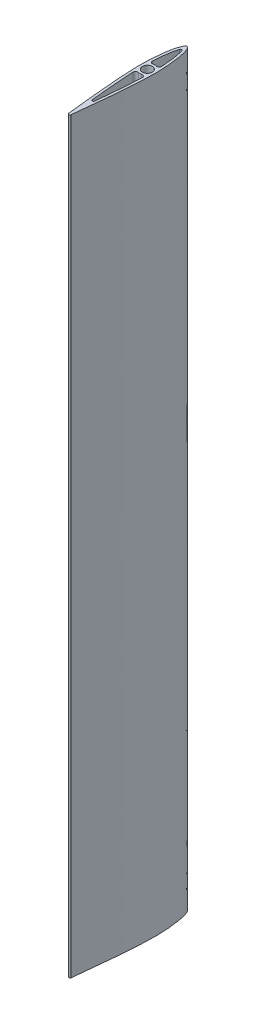
ISO-10303-21;
HEADER;
FILE_DESCRIPTION(('STEP AP214'),'2;1');
FILE_NAME('part.step','',(''),(''),'','','');
FILE_SCHEMA(('AUTOMOTIVE_DESIGN { 1 0 10303 214 1 1 1 1 }'));
ENDSEC;
DATA;
#1=APPLICATION_CONTEXT('core data for automotive mechanical design processes');
#2=APPLICATION_PROTOCOL_DEFINITION('international standard','automotive_design',2000,#1);
#3=PRODUCT_CONTEXT('',#1,'mechanical');
#4=PRODUCT('Part','Part','',(#3));
#5=PRODUCT_RELATED_PRODUCT_CATEGORY('part','',(#4));
#6=PRODUCT_DEFINITION_FORMATION('','',#4);
#7=PRODUCT_DEFINITION_CONTEXT('part definition',#1,'design');
#8=PRODUCT_DEFINITION('design','',#6,#7);
#9=PRODUCT_DEFINITION_SHAPE('','',#8);
#10=(LENGTH_UNIT() NAMED_UNIT(*) SI_UNIT(.MILLI.,.METRE.));
#11=(NAMED_UNIT(*) PLANE_ANGLE_UNIT() SI_UNIT($,.RADIAN.));
#12=(NAMED_UNIT(*) SI_UNIT($,.STERADIAN.) SOLID_ANGLE_UNIT());
#13=UNCERTAINTY_MEASURE_WITH_UNIT(LENGTH_MEASURE(1.E-05),#10,'distance_accuracy_value','');
#14=(GEOMETRIC_REPRESENTATION_CONTEXT(3) GLOBAL_UNCERTAINTY_ASSIGNED_CONTEXT((#13)) GLOBAL_UNIT_ASSIGNED_CONTEXT((#10,
#11,#12)) REPRESENTATION_CONTEXT('',''));
#15=CARTESIAN_POINT('',(0.,0.,0.));
#16=DIRECTION('',(0.,0.,1.));
#17=DIRECTION('',(1.,0.,0.));
#18=AXIS2_PLACEMENT_3D('',#15,#16,#17);
#19=CARTESIAN_POINT('',(-2.48951159685196,300.,-8.35675092429295));
#20=DIRECTION('',(0.,-1.,0.));
#21=DIRECTION('',(0.,0.,-1.));
#22=AXIS2_PLACEMENT_3D('',#19,#20,#21);
#23=PLANE('',#22);
#24=CARTESIAN_POINT('',(0.,300.,26.4458938838285));
#25=CARTESIAN_POINT('',(0.0604884544174839,300.,25.8806828526784));
#26=CARTESIAN_POINT('',(0.120261397903082,300.,25.3153955151066));
#27=CARTESIAN_POINT('',(0.238344658882728,300.,24.1846676612708));
#28=CARTESIAN_POINT('',(0.296654975228798,300.,23.6192271448869));
#29=CARTESIAN_POINT('',(0.46934988647915,300.,21.922622767737));
#30=CARTESIAN_POINT('',(0.581492710666243,300.,20.791229592031));
#31=CARTESIAN_POINT('',(0.799222248623128,300.,18.5278035549717));
#32=CARTESIAN_POINT('',(0.904808912589911,300.,17.3957706888251));
#33=CARTESIAN_POINT('',(1.10777266978677,300.,15.1378742653523));
#34=CARTESIAN_POINT('',(1.20519560449703,300.,14.0120148605878));
#35=CARTESIAN_POINT('',(1.34434800145996,300.,12.3226455329832));
#36=CARTESIAN_POINT('',(1.38956869703072,300.,11.7594226041168));
#37=CARTESIAN_POINT('',(1.47732755587827,300.,10.6327682570804));
#38=CARTESIAN_POINT('',(1.51986572562252,300.,10.0693368394163));
#39=CARTESIAN_POINT('',(1.60179910789095,300.,8.94219716133277));
#40=CARTESIAN_POINT('',(1.64119405587007,300.,8.37848888162041));
#41=CARTESIAN_POINT('',(1.71617934482378,300.,7.25082058222964));
#42=CARTESIAN_POINT('',(1.75176971133768,300.,6.68686056426661));
#43=CARTESIAN_POINT('',(1.81011095295501,300.,5.69524801787385));
#44=CARTESIAN_POINT('',(1.83388406238199,300.,5.26765577427957));
#45=CARTESIAN_POINT('',(1.8780261737644,300.,4.41230851670016));
#46=CARTESIAN_POINT('',(1.89839530550231,300.,3.98455350954419));
#47=CARTESIAN_POINT('',(1.92565085355559,300.,3.34280068687028));
#48=CARTESIAN_POINT('',(1.93418603397729,300.,3.1288726810992));
#49=CARTESIAN_POINT('',(1.94998022783016,300.,2.70096922930312));
#50=CARTESIAN_POINT('',(1.95723924216228,300.,2.48699378331172));
#51=CARTESIAN_POINT('',(1.97023405628435,300.,2.05900691390744));
#52=CARTESIAN_POINT('',(1.97596993464033,300.,1.84499549292024));
#53=CARTESIAN_POINT('',(1.98570942252621,300.,1.41693366877384));
#54=CARTESIAN_POINT('',(1.98971303236889,300.,1.20288326562169));
#55=CARTESIAN_POINT('',(1.99894444353483,300.,0.558488721596059));
#56=CARTESIAN_POINT('',(2.00132276701231,300.,0.128098310069688));
#57=CARTESIAN_POINT('',(1.99726528304949,300.,-0.732669519451628));
#58=CARTESIAN_POINT('',(1.99082905903567,300.,-1.16304693587114));
#59=CARTESIAN_POINT('',(1.97418215077185,300.,-1.80842525154572));
#60=CARTESIAN_POINT('',(1.96746770332538,300.,-2.02352109373421));
#61=CARTESIAN_POINT('',(1.95181475591698,300.,-2.45363295968739));
#62=CARTESIAN_POINT('',(1.9428762472295,300.,-2.66864898313562));
#63=CARTESIAN_POINT('',(1.92302236193378,300.,-3.0985610113626));
#64=CARTESIAN_POINT('',(1.91210723554636,300.,-3.31345702788311));
#65=CARTESIAN_POINT('',(1.88873464475596,300.,-3.74316482417585));
#66=CARTESIAN_POINT('',(1.87627717992888,300.,-3.95797660392492));
#67=CARTESIAN_POINT('',(1.85160476390733,300.,-4.35702905276403));
#68=CARTESIAN_POINT('',(1.83960616738222,300.,-4.54128305425929));
#69=CARTESIAN_POINT('',(1.81433225835347,300.,-4.90970254202918));
#70=CARTESIAN_POINT('',(1.80105694997973,300.,-5.09386802858821));
#71=CARTESIAN_POINT('',(1.75920553981811,300.,-5.64621204910645));
#72=CARTESIAN_POINT('',(1.72860382609733,300.,-6.01424022292783));
#73=CARTESIAN_POINT('',(1.6612804186876,300.,-6.7498510653373));
#74=CARTESIAN_POINT('',(1.62455688366905,300.,-7.11743356626721));
#75=CARTESIAN_POINT('',(1.54405762519054,300.,-7.85210093867567));
#76=CARTESIAN_POINT('',(1.50027685346815,300.,-8.21918526281311));
#77=CARTESIAN_POINT('',(1.4048501975757,300.,-8.94941755735853));
#78=CARTESIAN_POINT('',(1.3532685038648,300.,-9.31257386028028));
#79=CARTESIAN_POINT('',(1.24039563656631,300.,-10.0373464059866));
#80=CARTESIAN_POINT('',(1.1791059608335,300.,-10.3989628775291));
#81=CARTESIAN_POINT('',(1.07811723546684,300.,-10.9395398382283));
#82=CARTESIAN_POINT('',(1.04296130457526,300.,-11.1193520020009));
#83=CARTESIAN_POINT('',(0.969198959358473,300.,-11.4782647966849));
#84=CARTESIAN_POINT('',(0.930592676312161,300.,-11.6573654543971));
#85=CARTESIAN_POINT('',(0.849415753225838,300.,-12.0145718905195));
#86=CARTESIAN_POINT('',(0.806847175103314,300.,-12.1926781358203));
#87=CARTESIAN_POINT('',(0.717013901655104,300.,-12.5476954798834));
#88=CARTESIAN_POINT('',(0.669749705861427,300.,-12.7246067036411));
#89=CARTESIAN_POINT('',(0.592362460965305,300.,-12.9964365206765));
#90=CARTESIAN_POINT('',(0.564259539626059,300.,-13.0919313680108));
#91=CARTESIAN_POINT('',(0.506128528879842,300.,-13.2823191939215));
#92=CARTESIAN_POINT('',(0.476100752942495,300.,-13.3772122677468));
#93=CARTESIAN_POINT('',(0.413834518143774,300.,-13.566232523374));
#94=CARTESIAN_POINT('',(0.381596899881548,300.,-13.6603599813327));
#95=CARTESIAN_POINT('',(0.314393308963642,300.,-13.8479986441405));
#96=CARTESIAN_POINT('',(0.279418596380003,300.,-13.9415067471656));
#97=CARTESIAN_POINT('',(0.224542390948892,300.,-14.0808381460445));
#98=CARTESIAN_POINT('',(0.205843893103758,300.,-14.1271361979226));
#99=CARTESIAN_POINT('',(0.167541759599472,300.,-14.219354300413));
#100=CARTESIAN_POINT('',(0.147938175026096,300.,-14.2652743721876));
#101=CARTESIAN_POINT('',(0.10767052086248,300.,-14.3567411247869));
#102=CARTESIAN_POINT('',(0.0870047324548403,300.,-14.4022870526689));
#103=CARTESIAN_POINT('',(0.0444581391580542,300.,-14.492817486371));
#104=CARTESIAN_POINT('',(0.0225771007708116,300.,-14.5378018822505));
#105=CARTESIAN_POINT('',(0.,300.,-14.5824416458707));
#106=B_SPLINE_CURVE_WITH_KNOTS('',3,(#24,#25,#26,#27,#28,#29,#30,#31,#32,#33,#34,#35,#36,#37,
#38,#39,#40,#41,#42,#43,#44,#45,#46,#47,#48,#49,#50,#51,#52,#53,#54,#55,#56,#57,#58,#59,#60,#61,
#62,#63,#64,#65,#66,#67,#68,#69,#70,#71,#72,#73,#74,#75,#76,#77,#78,#79,#80,#81,#82,#83,#84,#85,
#86,#87,#88,#89,#90,#91,#92,#93,#94,#95,#96,#97,#98,#99,#100,#101,#102,#103,#104,#105),
.UNSPECIFIED.,.F.,.F.,(4,2,2,2,2,2,2,2,2,2,2,2,2,2,2,2,2,2,2,2,2,2,2,2,2,2,2,2,2,2,2,2,2,2,2,2,
2,2,2,2,4),(0.,1.70531455777449,3.41063045396496,6.82142370221408,10.2322428569368,
13.622407702543,15.3175088734378,17.0126059573625,18.7078455567131,20.4030737755877,
21.6878219009968,22.9725210320021,23.6148126479383,24.2571038104275,24.899361835968,
25.5416197455406,26.8327292624858,28.1238997990824,28.7694913038051,29.4150853413819,
30.0605977100074,30.7061102561275,31.2600385499934,31.8139650520822,32.9218118081547,
34.0299923870905,35.1389692291239,36.2392728371225,37.3394068431902,37.8890303763189,
38.4386330062828,38.9879512136272,39.5372110455219,39.8358273572966,40.1343951612543,
40.4328500169455,40.7323001507184,40.8820865286804,41.0318644625665,41.1818928989115,
41.3319502621193),.UNSPECIFIED.);
#107=CARTESIAN_POINT('',(0.497543059804354,300.,21.6297253535401));
#108=VERTEX_POINT('',#107);
#109=CARTESIAN_POINT('',(1.89958333636797,300.,3.94271777103058));
#110=VERTEX_POINT('',#109);
#111=EDGE_CURVE('E253',#108,#110,#106,.T.);
#112=ORIENTED_EDGE('',*,*,#111,.F.);
#113=CARTESIAN_POINT('',(0.,300.,21.5802187515508));
#114=DIRECTION('',(0.,-1.,0.));
#115=DIRECTION('',(0.,0.,-1.));
#116=AXIS2_PLACEMENT_3D('',#113,#114,#115);
#117=CIRCLE('',#116,0.5);
#118=CARTESIAN_POINT('',(-0.497543059804354,300.,21.6297253535401));
#119=VERTEX_POINT('',#118);
#120=EDGE_CURVE('E11',#108,#119,#117,.T.);
#121=ORIENTED_EDGE('',*,*,#120,.T.);
#122=CARTESIAN_POINT('',(0.,300.,-14.5824416458707));
#123=CARTESIAN_POINT('',(-0.0287654447601619,300.,-14.5255314992019));
#124=CARTESIAN_POINT('',(-0.0564180626355924,300.,-14.4680757120543));
#125=CARTESIAN_POINT('',(-0.109826721470625,300.,-14.3523087022673));
#126=CARTESIAN_POINT('',(-0.135583351912162,300.,-14.2939977523263));
#127=CARTESIAN_POINT('',(-0.185522580611292,300.,-14.1767769593728));
#128=CARTESIAN_POINT('',(-0.209706671780039,300.,-14.1178677476385));
#129=CARTESIAN_POINT('',(-0.256738753007453,300.,-13.9995137495193));
#130=CARTESIAN_POINT('',(-0.279586620678508,300.,-13.9400689146491));
#131=CARTESIAN_POINT('',(-0.34598062445714,300.,-13.7621632587138));
#132=CARTESIAN_POINT('',(-0.387822752577044,300.,-13.6430655612834));
#133=CARTESIAN_POINT('',(-0.4678536071872,300.,-13.4036240701403));
#134=CARTESIAN_POINT('',(-0.506041264091599,300.,-13.2832799229703));
#135=CARTESIAN_POINT('',(-0.579245406914188,300.,-13.0420246293127));
#136=CARTESIAN_POINT('',(-0.61427097318971,300.,-12.9211162278471));
#137=CARTESIAN_POINT('',(-0.681710478783984,300.,-12.6785906866806));
#138=CARTESIAN_POINT('',(-0.71412469862775,300.,-12.5569736246171));
#139=CARTESIAN_POINT('',(-0.776649169578209,300.,-12.3132589289898));
#140=CARTESIAN_POINT('',(-0.806761327282065,300.,-12.1911617831343));
#141=CARTESIAN_POINT('',(-0.864967712090199,300.,-11.9464857265397));
#142=CARTESIAN_POINT('',(-0.893061880275354,300.,-11.8239068018443));
#143=CARTESIAN_POINT('',(-0.974628438908706,300.,-11.4556066022291));
#144=CARTESIAN_POINT('',(-1.02539448360941,300.,-11.2092838838677));
#145=CARTESIAN_POINT('',(-1.12096227832814,300.,-10.7154566818347));
#146=CARTESIAN_POINT('',(-1.16576304907965,300.,-10.4679520110234));
#147=CARTESIAN_POINT('',(-1.24993424474362,300.,-9.97405462205377));
#148=CARTESIAN_POINT('',(-1.28934510325823,300.,-9.72766876307048));
#149=CARTESIAN_POINT('',(-1.36383761213938,300.,-9.23403210729239));
#150=CARTESIAN_POINT('',(-1.39891553636007,300.,-8.98678075150769));
#151=CARTESIAN_POINT('',(-1.46523523721675,300.,-8.49158819705314));
#152=CARTESIAN_POINT('',(-1.49647428042764,300.,-8.24364663392592));
#153=CARTESIAN_POINT('',(-1.55550971573769,300.,-7.74723840285978));
#154=CARTESIAN_POINT('',(-1.58330449196933,300.,-7.49877154365729));
#155=CARTESIAN_POINT('',(-1.63577387748471,300.,-7.00146827068149));
#156=CARTESIAN_POINT('',(-1.66044797610608,300.,-6.75263180314908));
#157=CARTESIAN_POINT('',(-1.69532121741016,300.,-6.37920285887276));
#158=CARTESIAN_POINT('',(-1.70658837542335,300.,-6.25470896155664));
#159=CARTESIAN_POINT('',(-1.72844134434179,300.,-6.00566061944068));
#160=CARTESIAN_POINT('',(-1.73902715141207,300.,-5.88110617430403));
#161=CARTESIAN_POINT('',(-1.76747631869513,300.,-5.53563807906437));
#162=CARTESIAN_POINT('',(-1.78463962818141,300.,-5.31466654210723));
#163=CARTESIAN_POINT('',(-1.81706055280272,300.,-4.87258241651161));
#164=CARTESIAN_POINT('',(-1.83231815144138,300.,-4.65146982666878));
#165=CARTESIAN_POINT('',(-1.86103428498108,300.,-4.20912106681424));
#166=CARTESIAN_POINT('',(-1.87449276144061,300.,-3.98788489302239));
#167=CARTESIAN_POINT('',(-1.8997878689216,300.,-3.54531999027942));
#168=CARTESIAN_POINT('',(-1.91162450115897,300.,-3.32399126139782));
#169=CARTESIAN_POINT('',(-1.93336940783536,300.,-2.8814245793501));
#170=CARTESIAN_POINT('',(-1.94327929733958,300.,-2.66018670663238));
#171=CARTESIAN_POINT('',(-1.96078895260571,300.,-2.21761996925273));
#172=CARTESIAN_POINT('',(-1.96838873186198,300.,-1.99629110512987));
#173=CARTESIAN_POINT('',(-1.98114897925387,300.,-1.5535738552767));
#174=CARTESIAN_POINT('',(-1.98630956981273,300.,-1.33218547309176));
#175=CARTESIAN_POINT('',(-1.994189398361,300.,-0.889364801573485));
#176=CARTESIAN_POINT('',(-1.99690862212304,300.,-0.667932511991792));
#177=CARTESIAN_POINT('',(-2.00154166611556,300.,-0.0035927952030189));
#178=CARTESIAN_POINT('',(-1.99993042837207,300.,0.439342208735876));
#179=CARTESIAN_POINT('',(-1.98852811560407,300.,1.32511514550508));
#180=CARTESIAN_POINT('',(-1.97873667886172,300.,1.76795307317664));
#181=CARTESIAN_POINT('',(-1.95903789217656,300.,2.43226383298746));
#182=CARTESIAN_POINT('',(-1.9516316300877,300.,2.65381536998964));
#183=CARTESIAN_POINT('',(-1.93544109462003,300.,3.09686819223906));
#184=CARTESIAN_POINT('',(-1.92665682040677,300.,3.31836947745578));
#185=CARTESIAN_POINT('',(-1.89853043094663,300.,3.9827907490555));
#186=CARTESIAN_POINT('',(-1.87741451084011,300.,4.42563567503905));
#187=CARTESIAN_POINT('',(-1.83153960705754,300.,5.31151781717359));
#188=CARTESIAN_POINT('',(-1.80677748365615,300.,5.75455486762716));
#189=CARTESIAN_POINT('',(-1.75431524702905,300.,6.64045632106473));
#190=CARTESIAN_POINT('',(-1.72661511740656,300.,7.08332072307137));
#191=CARTESIAN_POINT('',(-1.63985256947229,300.,8.41207115499243));
#192=CARTESIAN_POINT('',(-1.57714944319189,300.,9.29771939952226));
#193=CARTESIAN_POINT('',(-1.44288518147602,300.,11.0906652673376));
#194=CARTESIAN_POINT('',(-1.37114138610749,300.,11.9979490108048));
#195=CARTESIAN_POINT('',(-1.22163922442714,300.,13.8117821989946));
#196=CARTESIAN_POINT('',(-1.14388242203121,300.,14.7183317730971));
#197=CARTESIAN_POINT('',(-0.983389683837955,300.,16.5301275212946));
#198=CARTESIAN_POINT('',(-0.900658508594311,300.,17.4353741186574));
#199=CARTESIAN_POINT('',(-0.730915083785289,300.,19.2439634337448));
#200=CARTESIAN_POINT('',(-0.643910097645236,300.,20.1473068343954));
#201=CARTESIAN_POINT('',(-0.466113343061597,300.,21.9514693334985));
#202=CARTESIAN_POINT('',(-0.375330988836556,300.,22.8522893610119));
#203=CARTESIAN_POINT('',(-0.190281572337135,300.,24.6507668695156));
#204=CARTESIAN_POINT('',(-0.0960261079001675,300.,25.548425543403));
#205=CARTESIAN_POINT('',(0.,300.,26.4458938838285));
#206=B_SPLINE_CURVE_WITH_KNOTS('',3,(#122,#123,#124,#125,#126,#127,#128,#129,#130,#131,#132,
#133,#134,#135,#136,#137,#138,#139,#140,#141,#142,#143,#144,#145,#146,#147,#148,#149,#150,#151,
#152,#153,#154,#155,#156,#157,#158,#159,#160,#161,#162,#163,#164,#165,#166,#167,#168,#169,#170,
#171,#172,#173,#174,#175,#176,#177,#178,#179,#180,#181,#182,#183,#184,#185,#186,#187,#188,#189,
#190,#191,#192,#193,#194,#195,#196,#197,#198,#199,#200,#201,#202,#203,#204,#205),.UNSPECIFIED.,
.F.,.F.,(4,2,2,2,2,2,2,2,2,2,2,2,2,2,2,2,2,2,2,2,2,2,2,2,2,2,2,2,2,2,2,2,2,2,2,2,2,2,2,2,2,4),
(0.,0.191266850435598,0.382473980654546,0.573496852467355,0.764537193166455,1.14315512579045,
1.52188353506251,1.89948727158252,2.27705038961741,2.65429733900787,3.0315552983825,
3.78595363327973,4.54047565882637,5.28898421884733,6.03813204929237,6.78781024734962,
7.53783883373216,8.28798999515871,8.66299660213991,9.03800531964801,9.70290702357895,
10.3678144826861,11.0327435349745,11.6976720887612,12.3620408494697,13.0264057292364,
13.6907372608917,14.3550726639938,15.6837892924975,17.0125646782449,17.6775867814592,
18.3426092873775,19.6726317182964,21.0038061951046,22.3349881014802,24.9985386204645,
27.7288638221915,30.4584812699311,33.1855267729004,35.908087971739,38.6242285773721,
41.3320009587292),.UNSPECIFIED.);
#207=CARTESIAN_POINT('',(-1.89958333636797,300.,3.94271777103058));
#208=VERTEX_POINT('',#207);
#209=EDGE_CURVE('E256',#208,#119,#206,.T.);
#210=ORIENTED_EDGE('',*,*,#209,.F.);
#211=CARTESIAN_POINT('',(-0.900615580758259,300.,3.89729285218541));
#212=DIRECTION('',(0.,-1.,0.));
#213=DIRECTION('',(0.,0.,-1.));
#214=AXIS2_PLACEMENT_3D('',#211,#212,#213);
#215=CIRCLE('',#214,1.);
#216=CARTESIAN_POINT('',(-0.675461685568694,300.,2.92296963913906));
#217=VERTEX_POINT('',#216);
#218=EDGE_CURVE('E198',#208,#217,#215,.T.);
#219=ORIENTED_EDGE('',*,*,#218,.T.);
#220=CARTESIAN_POINT('',(0.,300.,0.));
#221=DIRECTION('',(0.,-1.,0.));
#222=DIRECTION('',(0.,0.,-1.));
#223=AXIS2_PLACEMENT_3D('',#220,#221,#222);
#224=CIRCLE('',#223,3.);
#225=CARTESIAN_POINT('',(0.675461685568693,300.,2.92296963913906));
#226=VERTEX_POINT('',#225);
#227=EDGE_CURVE('E316',#217,#226,#224,.F.);
#228=ORIENTED_EDGE('',*,*,#227,.T.);
#229=CARTESIAN_POINT('',(0.900615580758259,300.,3.89729285218541));
#230=DIRECTION('',(0.,-1.,0.));
#231=DIRECTION('',(0.,0.,-1.));
#232=AXIS2_PLACEMENT_3D('',#229,#230,#231);
#233=CIRCLE('',#232,1.);
#234=EDGE_CURVE('E193',#226,#110,#233,.T.);
#235=ORIENTED_EDGE('',*,*,#234,.T.);
#236=EDGE_LOOP('',(#112,#121,#210,#219,#228,#235));
#237=FACE_BOUND('',#236,.T.);
#238=CARTESIAN_POINT('',(0.,300.,-16.));
#239=CARTESIAN_POINT('',(-0.743965244648387,300.,-16.));
#240=CARTESIAN_POINT('',(-2.65296199535098,300.,-12.5405944164556));
#241=CARTESIAN_POINT('',(-3.18465905456481,300.,4.39750310495019));
#242=CARTESIAN_POINT('',(-1.68541967240141,300.,20.6240971222785));
#243=CARTESIAN_POINT('',(-0.496785927838268,300.,31.0566016068842));
#244=B_SPLINE_CURVE_WITH_KNOTS('',3,(#238,#239,#240,#241,#242,#243),.UNSPECIFIED.,.F.,.F.,(4,1,
1,4),(0.,0.615228923789054,0.714424289742173,0.991953659531186),.UNSPECIFIED.);
#245=CARTESIAN_POINT('',(0.,300.,-16.));
#246=VERTEX_POINT('',#245);
#247=CARTESIAN_POINT('',(-0.496785927838294,300.,31.056601606884));
#248=VERTEX_POINT('',#247);
#249=EDGE_CURVE('E154',#246,#248,#244,.T.);
#250=ORIENTED_EDGE('',*,*,#249,.T.);
#251=CARTESIAN_POINT('',(0.,300.,31.));
#252=DIRECTION('',(0.,1.,0.));
#253=DIRECTION('',(0.,0.,1.));
#254=AXIS2_PLACEMENT_3D('',#251,#252,#253);
#255=CIRCLE('',#254,0.500000000000001);
#256=CARTESIAN_POINT('',(0.496785927838268,300.,31.0566016068842));
#257=VERTEX_POINT('',#256);
#258=EDGE_CURVE('E143',#248,#257,#255,.T.);
#259=ORIENTED_EDGE('',*,*,#258,.T.);
#260=CARTESIAN_POINT('',(0.496785927838268,300.,31.0566016068842));
#261=CARTESIAN_POINT('',(1.68541967240141,300.,20.6240971222785));
#262=CARTESIAN_POINT('',(3.18465905456481,300.,4.39750310495019));
#263=CARTESIAN_POINT('',(2.65296199535098,300.,-12.5405944164556));
#264=CARTESIAN_POINT('',(0.743965244648387,300.,-16.));
#265=CARTESIAN_POINT('',(0.,300.,-16.));
#266=B_SPLINE_CURVE_WITH_KNOTS('',3,(#260,#261,#262,#263,#264,#265),.UNSPECIFIED.,.F.,.F.,(4,1,
1,4),(0.,0.277529369789013,0.376724735742132,0.991953659531186),.UNSPECIFIED.);
#267=EDGE_CURVE('E153',#257,#246,#266,.T.);
#268=ORIENTED_EDGE('',*,*,#267,.T.);
#269=EDGE_LOOP('',(#250,#259,#268));
#270=FACE_BOUND('',#269,.T.);
#271=CARTESIAN_POINT('',(0.,300.,0.));
#272=DIRECTION('',(0.,1.,0.));
#273=DIRECTION('',(0.,0.,1.));
#274=AXIS2_PLACEMENT_3D('',#271,#272,#273);
#275=CIRCLE('',#274,2.);
#276=CARTESIAN_POINT('',(0.,300.,2.));
#277=VERTEX_POINT('',#276);
#278=EDGE_CURVE('E327',#277,#277,#275,.T.);
#279=ORIENTED_EDGE('',*,*,#278,.F.);
#280=EDGE_LOOP('',(#279));
#281=FACE_BOUND('',#280,.T.);
#282=CARTESIAN_POINT('',(-0.476095052819857,300.,-13.3759712460339));
#283=VERTEX_POINT('',#282);
#284=CARTESIAN_POINT('',(-1.87577824575645,300.,-3.96179221138492));
#285=VERTEX_POINT('',#284);
#286=EDGE_CURVE('E249',#283,#285,#206,.T.);
#287=ORIENTED_EDGE('',*,*,#286,.F.);
#288=CARTESIAN_POINT('',(0.,300.,-13.2232181750976));
#289=DIRECTION('',(0.,-1.,0.));
#290=DIRECTION('',(0.,0.,-1.));
#291=AXIS2_PLACEMENT_3D('',#288,#289,#290);
#292=CIRCLE('',#291,0.5);
#293=CARTESIAN_POINT('',(0.476095052819858,300.,-13.3759712460339));
#294=VERTEX_POINT('',#293);
#295=EDGE_CURVE('E220',#283,#294,#292,.T.);
#296=ORIENTED_EDGE('',*,*,#295,.T.);
#297=CARTESIAN_POINT('',(1.87577824575694,300.,-3.96179221137663));
#298=VERTEX_POINT('',#297);
#299=EDGE_CURVE('E248',#298,#294,#106,.T.);
#300=ORIENTED_EDGE('',*,*,#299,.F.);
#301=CARTESIAN_POINT('',(0.877534326622098,300.,-3.90255474088448));
#302=DIRECTION('',(0.,-1.,0.));
#303=DIRECTION('',(0.,0.,-1.));
#304=AXIS2_PLACEMENT_3D('',#301,#302,#303);
#305=CIRCLE('',#304,1.);
#306=CARTESIAN_POINT('',(0.658150744966573,300.,-2.92691605566336));
#307=VERTEX_POINT('',#306);
#308=EDGE_CURVE('E202',#298,#307,#305,.T.);
#309=ORIENTED_EDGE('',*,*,#308,.T.);
#310=CARTESIAN_POINT('',(-0.658150744966573,300.,-2.92691605566336));
#311=VERTEX_POINT('',#310);
#312=EDGE_CURVE('E242',#307,#311,#224,.F.);
#313=ORIENTED_EDGE('',*,*,#312,.T.);
#314=CARTESIAN_POINT('',(-0.877534326622098,300.,-3.90255474088448));
#315=DIRECTION('',(0.,-1.,0.));
#316=DIRECTION('',(0.,0.,-1.));
#317=AXIS2_PLACEMENT_3D('',#314,#315,#316);
#318=CIRCLE('',#317,1.);
#319=EDGE_CURVE('E206',#311,#285,#318,.T.);
#320=ORIENTED_EDGE('',*,*,#319,.T.);
#321=EDGE_LOOP('',(#287,#296,#300,#309,#313,#320));
#322=FACE_BOUND('',#321,.T.);
#323=ADVANCED_FACE('F38',(#237,#270,#281,#322),#23,.F.);
#324=CARTESIAN_POINT('',(-2.48951159685196,0.,-8.35675092429295));
#325=DIRECTION('',(0.,-1.,0.));
#326=DIRECTION('',(0.,0.,-1.));
#327=AXIS2_PLACEMENT_3D('',#324,#325,#326);
#328=PLANE('',#327);
#329=CARTESIAN_POINT('',(0.,0.,0.));
#330=DIRECTION('',(0.,-1.,0.));
#331=DIRECTION('',(0.,0.,-1.));
#332=AXIS2_PLACEMENT_3D('',#329,#330,#331);
#333=CIRCLE('',#332,3.);
#334=CARTESIAN_POINT('',(0.658150744966573,0.,-2.92691605566336));
#335=VERTEX_POINT('',#334);
#336=CARTESIAN_POINT('',(-0.658150744966573,0.,-2.92691605566336));
#337=VERTEX_POINT('',#336);
#338=EDGE_CURVE('E321',#335,#337,#333,.F.);
#339=ORIENTED_EDGE('',*,*,#338,.F.);
#340=CARTESIAN_POINT('',(0.877534326622098,0.,-3.90255474088448));
#341=DIRECTION('',(0.,-1.,0.));
#342=DIRECTION('',(0.,0.,-1.));
#343=AXIS2_PLACEMENT_3D('',#340,#341,#342);
#344=CIRCLE('',#343,1.);
#345=CARTESIAN_POINT('',(1.87577824575645,0.,-3.96179221138492));
#346=VERTEX_POINT('',#345);
#347=EDGE_CURVE('E204',#335,#346,#344,.F.);
#348=ORIENTED_EDGE('',*,*,#347,.T.);
#349=CARTESIAN_POINT('',(0.,0.,26.4458938838285));
#350=CARTESIAN_POINT('',(0.0604884544174867,0.,25.8806828526783));
#351=CARTESIAN_POINT('',(0.120261397903084,0.,25.3153955151065));
#352=CARTESIAN_POINT('',(0.23834465888273,0.,24.1846676612707));
#353=CARTESIAN_POINT('',(0.296654975228799,0.,23.6192271448868));
#354=CARTESIAN_POINT('',(0.469349886479151,0.,21.922622767737));
#355=CARTESIAN_POINT('',(0.581492710666247,0.,20.791229592031));
#356=CARTESIAN_POINT('',(0.799222248623133,0.,18.5278035549717));
#357=CARTESIAN_POINT('',(0.904808912589914,0.,17.395770688825));
#358=CARTESIAN_POINT('',(1.10777266978677,0.,15.1378742653523));
#359=CARTESIAN_POINT('',(1.20519560449703,0.,14.0120148605878));
#360=CARTESIAN_POINT('',(1.34434800145997,0.,12.3226455329832));
#361=CARTESIAN_POINT('',(1.38956869703072,0.,11.7594226041168));
#362=CARTESIAN_POINT('',(1.47732755587827,0.,10.6327682570803));
#363=CARTESIAN_POINT('',(1.51986572562252,0.,10.0693368394163));
#364=CARTESIAN_POINT('',(1.60179910789095,0.,8.94219716133276));
#365=CARTESIAN_POINT('',(1.64119405587007,0.,8.37848888162039));
#366=CARTESIAN_POINT('',(1.71617934482379,0.,7.25082058222962));
#367=CARTESIAN_POINT('',(1.75176971133768,0.,6.68686056426659));
#368=CARTESIAN_POINT('',(1.81011095295502,0.,5.69524801787383));
#369=CARTESIAN_POINT('',(1.833884062382,0.,5.26765577427956));
#370=CARTESIAN_POINT('',(1.8780261737644,0.,4.41230851670014));
#371=CARTESIAN_POINT('',(1.89839530550231,0.,3.98455350954417));
#372=CARTESIAN_POINT('',(1.92565085355559,0.,3.34280068687026));
#373=CARTESIAN_POINT('',(1.93418603397729,0.,3.12887268109918));
#374=CARTESIAN_POINT('',(1.94998022783016,0.,2.70096922930311));
#375=CARTESIAN_POINT('',(1.95723924216228,0.,2.48699378331171));
#376=CARTESIAN_POINT('',(1.97023405628435,0.,2.05900691390743));
#377=CARTESIAN_POINT('',(1.97596993464033,0.,1.84499549292023));
#378=CARTESIAN_POINT('',(1.98570942252621,0.,1.41693366877383));
#379=CARTESIAN_POINT('',(1.98971303236889,0.,1.20288326562168));
#380=CARTESIAN_POINT('',(1.99894444353483,0.,0.558488721596045));
#381=CARTESIAN_POINT('',(2.00132276701231,0.,0.128098310069674));
#382=CARTESIAN_POINT('',(1.99726528304949,0.,-0.732669519451642));
#383=CARTESIAN_POINT('',(1.99082905903567,0.,-1.16304693587116));
#384=CARTESIAN_POINT('',(1.97418215077185,0.,-1.80842525154573));
#385=CARTESIAN_POINT('',(1.96746770332538,0.,-2.02352109373422));
#386=CARTESIAN_POINT('',(1.95181475591698,0.,-2.4536329596874));
#387=CARTESIAN_POINT('',(1.9428762472295,0.,-2.66864898313563));
#388=CARTESIAN_POINT('',(1.92302236193378,0.,-3.09856101136262));
#389=CARTESIAN_POINT('',(1.91210723554636,0.,-3.31345702788312));
#390=CARTESIAN_POINT('',(1.88873464475596,0.,-3.74316482417587));
#391=CARTESIAN_POINT('',(1.87627717992888,-1.18556502379102E-13,-3.95797660392493));
#392=CARTESIAN_POINT('',(1.85160476390733,-1.04557042367225E-13,-4.35702905276404));
#393=CARTESIAN_POINT('',(1.83960616738222,0.,-4.5412830542593));
#394=CARTESIAN_POINT('',(1.81433225835347,0.,-4.90970254202919));
#395=CARTESIAN_POINT('',(1.80105694997973,0.,-5.09386802858822));
#396=CARTESIAN_POINT('',(1.75920553981811,0.,-5.64621204910646));
#397=CARTESIAN_POINT('',(1.72860382609733,0.,-6.01424022292783));
#398=CARTESIAN_POINT('',(1.6612804186876,0.,-6.7498510653373));
#399=CARTESIAN_POINT('',(1.62455688366905,0.,-7.1174335662672));
#400=CARTESIAN_POINT('',(1.54405762519054,0.,-7.85210093867566));
#401=CARTESIAN_POINT('',(1.50027685346815,0.,-8.2191852628131));
#402=CARTESIAN_POINT('',(1.40485019757571,0.,-8.94941755735852));
#403=CARTESIAN_POINT('',(1.3532685038648,0.,-9.31257386028027));
#404=CARTESIAN_POINT('',(1.24039563656632,0.,-10.0373464059865));
#405=CARTESIAN_POINT('',(1.17910596083351,0.,-10.3989628775291));
#406=CARTESIAN_POINT('',(1.07811723546685,0.,-10.9395398382283));
#407=CARTESIAN_POINT('',(1.04296130457527,0.,-11.1193520020009));
#408=CARTESIAN_POINT('',(0.96919895935848,0.,-11.4782647966849));
#409=CARTESIAN_POINT('',(0.930592676312168,0.,-11.657365454397));
#410=CARTESIAN_POINT('',(0.849415753225845,0.,-12.0145718905195));
#411=CARTESIAN_POINT('',(0.806847175103323,0.,-12.1926781358203));
#412=CARTESIAN_POINT('',(0.717013901655115,0.,-12.5476954798833));
#413=CARTESIAN_POINT('',(0.669749705861439,0.,-12.7246067036411));
#414=CARTESIAN_POINT('',(0.592362460965318,0.,-12.9964365206765));
#415=CARTESIAN_POINT('',(0.56425953962607,0.,-13.0919313680107));
#416=CARTESIAN_POINT('',(0.506128528879851,0.,-13.2823191939214));
#417=CARTESIAN_POINT('',(0.476100752942504,0.,-13.3772122677468));
#418=CARTESIAN_POINT('',(0.413834518143781,0.,-13.566232523374));
#419=CARTESIAN_POINT('',(0.381596899881554,0.,-13.6603599813327));
#420=CARTESIAN_POINT('',(0.314393308963646,0.,-13.8479986441405));
#421=CARTESIAN_POINT('',(0.279418596380006,0.,-13.9415067471656));
#422=CARTESIAN_POINT('',(0.224542390948894,0.,-14.0808381460445));
#423=CARTESIAN_POINT('',(0.205843893103759,0.,-14.1271361979226));
#424=CARTESIAN_POINT('',(0.167541759599471,0.,-14.219354300413));
#425=CARTESIAN_POINT('',(0.147938175026094,0.,-14.2652743721876));
#426=CARTESIAN_POINT('',(0.107670520862475,0.,-14.3567411247869));
#427=CARTESIAN_POINT('',(0.0870047324548346,0.,-14.4022870526689));
#428=CARTESIAN_POINT('',(0.0444581391580477,0.,-14.492817486371));
#429=CARTESIAN_POINT('',(0.0225771007708053,0.,-14.5378018822505));
#430=CARTESIAN_POINT('',(0.,0.,-14.5824416458707));
#431=B_SPLINE_CURVE_WITH_KNOTS('',3,(#349,#350,#351,#352,#353,#354,#355,#356,#357,#358,#359,
#360,#361,#362,#363,#364,#365,#366,#367,#368,#369,#370,#371,#372,#373,#374,#375,#376,#377,#378,
#379,#380,#381,#382,#383,#384,#385,#386,#387,#388,#389,#390,#391,#392,#393,#394,#395,#396,#397,
#398,#399,#400,#401,#402,#403,#404,#405,#406,#407,#408,#409,#410,#411,#412,#413,#414,#415,#416,
#417,#418,#419,#420,#421,#422,#423,#424,#425,#426,#427,#428,#429,#430),.UNSPECIFIED.,.F.,.F.,(4,
2,2,2,2,2,2,2,2,2,2,2,2,2,2,2,2,2,2,2,2,2,2,2,2,2,2,2,2,2,2,2,2,2,2,2,2,2,2,2,4),(0.,
1.7053145577745,3.41063045396497,6.82142370221408,10.2322428569368,13.622407702543,
15.3175088734378,17.0126059573625,18.7078455567131,20.4030737755877,21.6878219009968,
22.9725210320021,23.6148126479383,24.2571038104275,24.899361835968,25.5416197455406,
26.8327292624858,28.1238997990824,28.7694913038051,29.4150853413819,30.0605977100074,
30.7061102561275,31.2600385499934,31.8139650520822,32.9218118081547,34.0299923870905,
35.1389692291239,36.2392728371225,37.3394068431901,37.8890303763189,38.4386330062827,
38.9879512136272,39.5372110455219,39.8358273572965,40.1343951612542,40.4328500169455,
40.7323001507183,40.8820865286804,41.0318644625665,41.1818928989115,41.3319502621193),.UNSPECIFIED.);
#432=CARTESIAN_POINT('',(0.476095052819856,0.,-13.3759712460339));
#433=VERTEX_POINT('',#432);
#434=EDGE_CURVE('E232',#346,#433,#431,.T.);
#435=ORIENTED_EDGE('',*,*,#434,.T.);
#436=CARTESIAN_POINT('',(0.,0.,-13.2232181750976));
#437=DIRECTION('',(0.,-1.,0.));
#438=DIRECTION('',(0.,0.,-1.));
#439=AXIS2_PLACEMENT_3D('',#436,#437,#438);
#440=CIRCLE('',#439,0.5);
#441=CARTESIAN_POINT('',(-0.476095052819857,0.,-13.3759712460339));
#442=VERTEX_POINT('',#441);
#443=EDGE_CURVE('E222',#433,#442,#440,.F.);
#444=ORIENTED_EDGE('',*,*,#443,.T.);
#445=CARTESIAN_POINT('',(0.,0.,-14.5824416458707));
#446=CARTESIAN_POINT('',(-0.0287654447601614,0.,-14.5255314992019));
#447=CARTESIAN_POINT('',(-0.0564180626355908,0.,-14.4680757120543));
#448=CARTESIAN_POINT('',(-0.10982672147062,0.,-14.3523087022673));
#449=CARTESIAN_POINT('',(-0.135583351912155,0.,-14.2939977523264));
#450=CARTESIAN_POINT('',(-0.185522580611286,0.,-14.1767769593728));
#451=CARTESIAN_POINT('',(-0.209706671780036,0.,-14.1178677476385));
#452=CARTESIAN_POINT('',(-0.25673875300745,0.,-13.9995137495193));
#453=CARTESIAN_POINT('',(-0.279586620678504,0.,-13.9400689146492));
#454=CARTESIAN_POINT('',(-0.345980624457133,0.,-13.7621632587138));
#455=CARTESIAN_POINT('',(-0.387822752577038,0.,-13.6430655612834));
#456=CARTESIAN_POINT('',(-0.467853607187196,0.,-13.4036240701403));
#457=CARTESIAN_POINT('',(-0.506041264091595,0.,-13.2832799229703));
#458=CARTESIAN_POINT('',(-0.579245406914184,0.,-13.0420246293128));
#459=CARTESIAN_POINT('',(-0.614270973189707,0.,-12.9211162278471));
#460=CARTESIAN_POINT('',(-0.68171047878398,0.,-12.6785906866807));
#461=CARTESIAN_POINT('',(-0.714124698627745,0.,-12.5569736246172));
#462=CARTESIAN_POINT('',(-0.776649169578205,0.,-12.3132589289898));
#463=CARTESIAN_POINT('',(-0.806761327282062,0.,-12.1911617831343));
#464=CARTESIAN_POINT('',(-0.864967712090197,0.,-11.9464857265397));
#465=CARTESIAN_POINT('',(-0.89306188027535,0.,-11.8239068018444));
#466=CARTESIAN_POINT('',(-0.974628438908699,0.,-11.4556066022291));
#467=CARTESIAN_POINT('',(-1.02539448360941,0.,-11.2092838838677));
#468=CARTESIAN_POINT('',(-1.12096227832813,0.,-10.7154566818347));
#469=CARTESIAN_POINT('',(-1.16576304907964,0.,-10.4679520110235));
#470=CARTESIAN_POINT('',(-1.24993424474361,0.,-9.9740546220538));
#471=CARTESIAN_POINT('',(-1.28934510325822,0.,-9.72766876307051));
#472=CARTESIAN_POINT('',(-1.36383761213937,0.,-9.23403210729243));
#473=CARTESIAN_POINT('',(-1.39891553636007,0.,-8.98678075150772));
#474=CARTESIAN_POINT('',(-1.46523523721675,0.,-8.49158819705318));
#475=CARTESIAN_POINT('',(-1.49647428042764,0.,-8.24364663392596));
#476=CARTESIAN_POINT('',(-1.55550971573769,0.,-7.74723840285983));
#477=CARTESIAN_POINT('',(-1.58330449196932,0.,-7.49877154365734));
#478=CARTESIAN_POINT('',(-1.63577387748471,0.,-7.00146827068154));
#479=CARTESIAN_POINT('',(-1.66044797610607,0.,-6.75263180314913));
#480=CARTESIAN_POINT('',(-1.69532121741015,0.,-6.37920285887281));
#481=CARTESIAN_POINT('',(-1.70658837542335,0.,-6.25470896155669));
#482=CARTESIAN_POINT('',(-1.72844134434178,0.,-6.00566061944073));
#483=CARTESIAN_POINT('',(-1.73902715141207,0.,-5.88110617430408));
#484=CARTESIAN_POINT('',(-1.76747631869512,1.46942625891046E-13,-5.53563807906442));
#485=CARTESIAN_POINT('',(-1.78463962818141,0.,-5.31466654210728));
#486=CARTESIAN_POINT('',(-1.81706055280272,0.,-4.87258241651166));
#487=CARTESIAN_POINT('',(-1.83231815144137,0.,-4.65146982666884));
#488=CARTESIAN_POINT('',(-1.86103428498108,0.,-4.20912106681429));
#489=CARTESIAN_POINT('',(-1.8744927614406,0.,-3.98788489302244));
#490=CARTESIAN_POINT('',(-1.8997878689216,0.,-3.54531999027948));
#491=CARTESIAN_POINT('',(-1.91162450115897,0.,-3.32399126139788));
#492=CARTESIAN_POINT('',(-1.93336940783536,0.,-2.88142457935016));
#493=CARTESIAN_POINT('',(-1.94327929733958,0.,-2.66018670663244));
#494=CARTESIAN_POINT('',(-1.96078895260571,0.,-2.21761996925278));
#495=CARTESIAN_POINT('',(-1.96838873186198,0.,-1.99629110512992));
#496=CARTESIAN_POINT('',(-1.98114897925387,0.,-1.55357385527675));
#497=CARTESIAN_POINT('',(-1.98630956981273,0.,-1.33218547309181));
#498=CARTESIAN_POINT('',(-1.994189398361,0.,-0.889364801573536));
#499=CARTESIAN_POINT('',(-1.99690862212304,0.,-0.667932511991844));
#500=CARTESIAN_POINT('',(-2.00154166611557,0.,-0.0035927952030691));
#501=CARTESIAN_POINT('',(-1.99993042837207,0.,0.439342208735826));
#502=CARTESIAN_POINT('',(-1.98852811560407,0.,1.32511514550503));
#503=CARTESIAN_POINT('',(-1.97873667886173,0.,1.76795307317659));
#504=CARTESIAN_POINT('',(-1.95903789217656,0.,2.43226383298741));
#505=CARTESIAN_POINT('',(-1.9516316300877,0.,2.65381536998959));
#506=CARTESIAN_POINT('',(-1.93544109462003,0.,3.09686819223901));
#507=CARTESIAN_POINT('',(-1.92665682040678,0.,3.31836947745574));
#508=CARTESIAN_POINT('',(-1.89853043094664,0.,3.98279074905545));
#509=CARTESIAN_POINT('',(-1.87741451084011,0.,4.425635675039));
#510=CARTESIAN_POINT('',(-1.83153960705754,0.,5.31151781717355));
#511=CARTESIAN_POINT('',(-1.80677748365616,0.,5.75455486762711));
#512=CARTESIAN_POINT('',(-1.75431524702905,0.,6.64045632106469));
#513=CARTESIAN_POINT('',(-1.72661511740656,0.,7.08332072307132));
#514=CARTESIAN_POINT('',(-1.63985256947229,0.,8.41207115499239));
#515=CARTESIAN_POINT('',(-1.5771494431919,0.,9.29771939952222));
#516=CARTESIAN_POINT('',(-1.44288518147602,0.,11.0906652673375));
#517=CARTESIAN_POINT('',(-1.37114138610749,0.,11.9979490108048));
#518=CARTESIAN_POINT('',(-1.22163922442715,0.,13.8117821989946));
#519=CARTESIAN_POINT('',(-1.14388242203121,0.,14.7183317730971));
#520=CARTESIAN_POINT('',(-0.983389683837959,0.,16.5301275212946));
#521=CARTESIAN_POINT('',(-0.900658508594315,0.,17.4353741186573));
#522=CARTESIAN_POINT('',(-0.730915083785293,0.,19.2439634337448));
#523=CARTESIAN_POINT('',(-0.643910097645239,0.,20.1473068343954));
#524=CARTESIAN_POINT('',(-0.4661133430616,0.,21.9514693334985));
#525=CARTESIAN_POINT('',(-0.37533098883656,0.,22.8522893610118));
#526=CARTESIAN_POINT('',(-0.190281572337139,0.,24.6507668695156));
#527=CARTESIAN_POINT('',(-0.0960261079001707,0.,25.5484255434029));
#528=CARTESIAN_POINT('',(0.,-1.11022302462516E-13,26.4458938838285));
#529=B_SPLINE_CURVE_WITH_KNOTS('',3,(#445,#446,#447,#448,#449,#450,#451,#452,#453,#454,#455,
#456,#457,#458,#459,#460,#461,#462,#463,#464,#465,#466,#467,#468,#469,#470,#471,#472,#473,#474,
#475,#476,#477,#478,#479,#480,#481,#482,#483,#484,#485,#486,#487,#488,#489,#490,#491,#492,#493,
#494,#495,#496,#497,#498,#499,#500,#501,#502,#503,#504,#505,#506,#507,#508,#509,#510,#511,#512,
#513,#514,#515,#516,#517,#518,#519,#520,#521,#522,#523,#524,#525,#526,#527,#528),.UNSPECIFIED.,
.F.,.F.,(4,2,2,2,2,2,2,2,2,2,2,2,2,2,2,2,2,2,2,2,2,2,2,2,2,2,2,2,2,2,2,2,2,2,2,2,2,2,2,2,2,4),
(0.,0.191266850435595,0.382473980654542,0.573496852467349,0.764537193166449,1.14315512579044,
1.5218835350625,1.89948727158251,2.2770503896174,2.65429733900786,3.03155529838249,
3.78595363327971,4.54047565882635,5.2889842188473,6.03813204929234,6.78781024734958,
7.53783883373212,8.28798999515867,8.66299660213986,9.03800531964797,9.7029070235789,
10.3678144826861,11.0327435349745,11.6976720887611,12.3620408494697,13.0264057292364,
13.6907372608917,14.3550726639938,15.6837892924975,17.0125646782449,17.6775867814592,
18.3426092873774,19.6726317182963,21.0038061951046,22.3349881014801,24.9985386204645,
27.7288638221915,30.4584812699311,33.1855267729004,35.908087971739,38.6242285773721,
41.3320009587291),.UNSPECIFIED.);
#530=CARTESIAN_POINT('',(-1.87577824575645,0.,-3.96179221138492));
#531=VERTEX_POINT('',#530);
#532=EDGE_CURVE('E230',#442,#531,#529,.T.);
#533=ORIENTED_EDGE('',*,*,#532,.T.);
#534=CARTESIAN_POINT('',(-0.877534326622098,0.,-3.90255474088448));
#535=DIRECTION('',(0.,-1.,0.));
#536=DIRECTION('',(0.,0.,-1.));
#537=AXIS2_PLACEMENT_3D('',#534,#535,#536);
#538=CIRCLE('',#537,1.);
#539=EDGE_CURVE('E209',#531,#337,#538,.F.);
#540=ORIENTED_EDGE('',*,*,#539,.T.);
#541=EDGE_LOOP('',(#339,#348,#435,#444,#533,#540));
#542=FACE_BOUND('',#541,.T.);
#543=CARTESIAN_POINT('',(0.,0.,-16.));
#544=CARTESIAN_POINT('',(-0.743965244648387,0.,-16.));
#545=CARTESIAN_POINT('',(-2.65296199535098,0.,-12.5405944164556));
#546=CARTESIAN_POINT('',(-3.18465905456481,0.,4.39750310495019));
#547=CARTESIAN_POINT('',(-1.68541967240141,0.,20.6240971222785));
#548=CARTESIAN_POINT('',(-0.496785927838268,0.,31.0566016068842));
#549=B_SPLINE_CURVE_WITH_KNOTS('',3,(#543,#544,#545,#546,#547,#548),.UNSPECIFIED.,.F.,.F.,(4,1,
1,4),(0.,0.615228923789054,0.714424289742173,0.991953659531186),.UNSPECIFIED.);
#550=CARTESIAN_POINT('',(0.,0.,-16.));
#551=VERTEX_POINT('',#550);
#552=CARTESIAN_POINT('',(-0.496785927838294,0.,31.056601606884));
#553=VERTEX_POINT('',#552);
#554=EDGE_CURVE('E165',#551,#553,#549,.T.);
#555=ORIENTED_EDGE('',*,*,#554,.F.);
#556=CARTESIAN_POINT('',(0.496785927838268,0.,31.0566016068842));
#557=CARTESIAN_POINT('',(1.68541967240141,0.,20.6240971222785));
#558=CARTESIAN_POINT('',(3.18465905456481,0.,4.39750310495019));
#559=CARTESIAN_POINT('',(2.65296199535098,0.,-12.5405944164556));
#560=CARTESIAN_POINT('',(0.743965244648387,0.,-16.));
#561=CARTESIAN_POINT('',(0.,0.,-16.));
#562=B_SPLINE_CURVE_WITH_KNOTS('',3,(#556,#557,#558,#559,#560,#561),.UNSPECIFIED.,.F.,.F.,(4,1,
1,4),(0.,0.277529369789013,0.376724735742132,0.991953659531186),.UNSPECIFIED.);
#563=CARTESIAN_POINT('',(0.496785927838268,0.,31.0566016068842));
#564=VERTEX_POINT('',#563);
#565=EDGE_CURVE('E161',#564,#551,#562,.T.);
#566=ORIENTED_EDGE('',*,*,#565,.F.);
#567=CARTESIAN_POINT('',(0.,0.,31.));
#568=DIRECTION('',(0.,1.,0.));
#569=DIRECTION('',(0.,0.,1.));
#570=AXIS2_PLACEMENT_3D('',#567,#568,#569);
#571=CIRCLE('',#570,0.500000000000001);
#572=EDGE_CURVE('E384',#553,#564,#571,.T.);
#573=ORIENTED_EDGE('',*,*,#572,.F.);
#574=EDGE_LOOP('',(#555,#566,#573));
#575=FACE_BOUND('',#574,.T.);
#576=CARTESIAN_POINT('',(0.,0.,0.));
#577=DIRECTION('',(0.,1.,0.));
#578=DIRECTION('',(0.,0.,1.));
#579=AXIS2_PLACEMENT_3D('',#576,#577,#578);
#580=CIRCLE('',#579,2.);
#581=CARTESIAN_POINT('',(0.,0.,2.));
#582=VERTEX_POINT('',#581);
#583=EDGE_CURVE('E255',#582,#582,#580,.T.);
#584=ORIENTED_EDGE('',*,*,#583,.T.);
#585=EDGE_LOOP('',(#584));
#586=FACE_BOUND('',#585,.T.);
#587=CARTESIAN_POINT('',(-0.675461685568694,0.,2.92296963913906));
#588=VERTEX_POINT('',#587);
#589=CARTESIAN_POINT('',(0.675461685568693,0.,2.92296963913906));
#590=VERTEX_POINT('',#589);
#591=EDGE_CURVE('E318',#588,#590,#333,.F.);
#592=ORIENTED_EDGE('',*,*,#591,.F.);
#593=CARTESIAN_POINT('',(-0.900615580758259,0.,3.89729285218541));
#594=DIRECTION('',(0.,-1.,0.));
#595=DIRECTION('',(0.,0.,-1.));
#596=AXIS2_PLACEMENT_3D('',#593,#594,#595);
#597=CIRCLE('',#596,1.);
#598=CARTESIAN_POINT('',(-1.89958333636797,0.,3.94271777103058));
#599=VERTEX_POINT('',#598);
#600=EDGE_CURVE('E200',#588,#599,#597,.F.);
#601=ORIENTED_EDGE('',*,*,#600,.T.);
#602=CARTESIAN_POINT('',(-0.497543059804354,0.,21.6297253535401));
#603=VERTEX_POINT('',#602);
#604=EDGE_CURVE('E241',#599,#603,#529,.T.);
#605=ORIENTED_EDGE('',*,*,#604,.T.);
#606=CARTESIAN_POINT('',(0.,0.,21.5802187515508));
#607=DIRECTION('',(0.,-1.,0.));
#608=DIRECTION('',(0.,0.,-1.));
#609=AXIS2_PLACEMENT_3D('',#606,#607,#608);
#610=CIRCLE('',#609,0.5);
#611=CARTESIAN_POINT('',(0.497543059804354,0.,21.6297253535401));
#612=VERTEX_POINT('',#611);
#613=EDGE_CURVE('E46',#603,#612,#610,.F.);
#614=ORIENTED_EDGE('',*,*,#613,.T.);
#615=CARTESIAN_POINT('',(1.89958333636797,0.,3.94271777103057));
#616=VERTEX_POINT('',#615);
#617=EDGE_CURVE('E291',#612,#616,#431,.T.);
#618=ORIENTED_EDGE('',*,*,#617,.T.);
#619=CARTESIAN_POINT('',(0.900615580758259,0.,3.89729285218541));
#620=DIRECTION('',(0.,-1.,0.));
#621=DIRECTION('',(0.,0.,-1.));
#622=AXIS2_PLACEMENT_3D('',#619,#620,#621);
#623=CIRCLE('',#622,1.);
#624=EDGE_CURVE('E196',#616,#590,#623,.F.);
#625=ORIENTED_EDGE('',*,*,#624,.T.);
#626=EDGE_LOOP('',(#592,#601,#605,#614,#618,#625));
#627=FACE_BOUND('',#626,.T.);
#628=ADVANCED_FACE('F228',(#542,#575,#586,#627),#328,.T.);
#629=DIRECTION('',(0.,-1.,0.));
#630=VECTOR('',#629,1.);
#631=SURFACE_OF_LINEAR_EXTRUSION('',#244,#630);
#632=ORIENTED_EDGE('',*,*,#554,.T.);
#633=DIRECTION('',(0.,-1.,0.));
#634=VECTOR('',#633,1.);
#635=CARTESIAN_POINT('',(-0.496785927838294,300.,31.056601606884));
#636=LINE('',#635,#634);
#637=EDGE_CURVE('E147',#248,#553,#636,.T.);
#638=ORIENTED_EDGE('',*,*,#637,.F.);
#639=ORIENTED_EDGE('',*,*,#249,.F.);
#640=DIRECTION('',(0.,-1.,0.));
#641=VECTOR('',#640,1.);
#642=CARTESIAN_POINT('',(0.,300.,-16.));
#643=LINE('',#642,#641);
#644=EDGE_CURVE('E170',#246,#551,#643,.T.);
#645=ORIENTED_EDGE('',*,*,#644,.T.);
#646=EDGE_LOOP('',(#632,#638,#639,#645));
#647=FACE_BOUND('',#646,.T.);
#648=ADVANCED_FACE('F163',(#647),#631,.F.);
#649=CARTESIAN_POINT('',(0.,300.,31.));
#650=DIRECTION('',(0.,-1.,0.));
#651=DIRECTION('',(0.,0.,-1.));
#652=AXIS2_PLACEMENT_3D('',#649,#650,#651);
#653=CYLINDRICAL_SURFACE('',#652,0.500000000000001);
#654=ORIENTED_EDGE('',*,*,#572,.T.);
#655=DIRECTION('',(0.,-1.,0.));
#656=VECTOR('',#655,1.);
#657=CARTESIAN_POINT('',(0.496785927838268,300.,31.0566016068842));
#658=LINE('',#657,#656);
#659=EDGE_CURVE('E150',#257,#564,#658,.T.);
#660=ORIENTED_EDGE('',*,*,#659,.F.);
#661=ORIENTED_EDGE('',*,*,#258,.F.);
#662=ORIENTED_EDGE('',*,*,#637,.T.);
#663=EDGE_LOOP('',(#654,#660,#661,#662));
#664=FACE_BOUND('',#663,.T.);
#665=ADVANCED_FACE('F145',(#664),#653,.T.);
#666=DIRECTION('',(0.,-1.,0.));
#667=VECTOR('',#666,1.);
#668=SURFACE_OF_LINEAR_EXTRUSION('',#266,#667);
#669=ORIENTED_EDGE('',*,*,#565,.T.);
#670=ORIENTED_EDGE('',*,*,#644,.F.);
#671=ORIENTED_EDGE('',*,*,#267,.F.);
#672=ORIENTED_EDGE('',*,*,#659,.T.);
#673=EDGE_LOOP('',(#669,#670,#671,#672));
#674=FACE_BOUND('',#673,.T.);
#675=ADVANCED_FACE('F371',(#674),#668,.F.);
#676=CARTESIAN_POINT('',(0.,300.,0.));
#677=DIRECTION('',(0.,-1.,0.));
#678=DIRECTION('',(0.,0.,-1.));
#679=AXIS2_PLACEMENT_3D('',#676,#677,#678);
#680=CYLINDRICAL_SURFACE('',#679,2.);
#681=ORIENTED_EDGE('',*,*,#278,.T.);
#682=EDGE_LOOP('',(#681));
#683=FACE_BOUND('',#682,.T.);
#684=ORIENTED_EDGE('',*,*,#583,.F.);
#685=EDGE_LOOP('',(#684));
#686=FACE_BOUND('',#685,.T.);
#687=ADVANCED_FACE('F370',(#683,#686),#680,.F.);
#688=CARTESIAN_POINT('',(0.496785927838268,300.,31.0566016068842));
#689=CARTESIAN_POINT('',(1.68541967240141,300.,20.6240971222785));
#690=CARTESIAN_POINT('',(3.18465905456481,300.,4.39750310495019));
#691=CARTESIAN_POINT('',(2.69293623207166,300.,-11.2671483663311));
#692=CARTESIAN_POINT('',(1.12588915090657,300.,-15.1825223647058));
#693=CARTESIAN_POINT('',(0.306602017436776,300.,-15.8624378369564));
#694=B_SPLINE_CURVE_WITH_KNOTS('',3,(#688,#689,#690,#691,#692,#693),.UNSPECIFIED.,.F.,.F.,(4,1,
1,4),(0.,0.277529369789013,0.376724735742132,0.91737624798658),.UNSPECIFIED.);
#695=DIRECTION('',(0.,-1.,0.));
#696=VECTOR('',#695,1.);
#697=SURFACE_OF_LINEAR_EXTRUSION('',#694,#696);
#698=OFFSET_SURFACE('',#697,1.,.F.);
#699=ORIENTED_EDGE('',*,*,#299,.T.);
#700=DIRECTION('',(0.,-1.,0.));
#701=VECTOR('',#700,1.);
#702=CARTESIAN_POINT('',(0.476095052819857,300.,-13.3759712460339));
#703=LINE('',#702,#701);
#704=EDGE_CURVE('E214',#294,#433,#703,.T.);
#705=ORIENTED_EDGE('',*,*,#704,.T.);
#706=ORIENTED_EDGE('',*,*,#434,.F.);
#707=DIRECTION('',(0.,-1.,0.));
#708=VECTOR('',#707,1.);
#709=CARTESIAN_POINT('',(1.87577824575645,0.,-3.96179221138492));
#710=LINE('',#709,#708);
#711=EDGE_CURVE('E182',#346,#298,#710,.F.);
#712=ORIENTED_EDGE('',*,*,#711,.T.);
#713=EDGE_LOOP('',(#699,#705,#706,#712));
#714=FACE_BOUND('',#713,.T.);
#715=ADVANCED_FACE('F251',(#714),#698,.T.);
#716=CARTESIAN_POINT('',(-0.306602017436775,300.,-15.8624378369564));
#717=CARTESIAN_POINT('',(-1.12588915090657,300.,-15.1825223647058));
#718=CARTESIAN_POINT('',(-2.69293623207166,300.,-11.2671483663311));
#719=CARTESIAN_POINT('',(-3.18465905456481,300.,4.39750310495019));
#720=CARTESIAN_POINT('',(-1.68541967240141,300.,20.6240971222785));
#721=CARTESIAN_POINT('',(-0.496785927838268,300.,31.0566016068842));
#722=B_SPLINE_CURVE_WITH_KNOTS('',3,(#716,#717,#718,#719,#720,#721),.UNSPECIFIED.,.F.,.F.,(4,1,
1,4),(0.0745774115446057,0.615228923789054,0.714424289742173,0.991953659531186),.UNSPECIFIED.);
#723=DIRECTION('',(0.,-1.,0.));
#724=VECTOR('',#723,1.);
#725=SURFACE_OF_LINEAR_EXTRUSION('',#722,#724);
#726=OFFSET_SURFACE('',#725,1.,.F.);
#727=ORIENTED_EDGE('',*,*,#532,.F.);
#728=DIRECTION('',(0.,-1.,0.));
#729=VECTOR('',#728,1.);
#730=CARTESIAN_POINT('',(-0.476095052819858,0.,-13.3759712460339));
#731=LINE('',#730,#729);
#732=EDGE_CURVE('E211',#442,#283,#731,.F.);
#733=ORIENTED_EDGE('',*,*,#732,.T.);
#734=ORIENTED_EDGE('',*,*,#286,.T.);
#735=DIRECTION('',(0.,-1.,0.));
#736=VECTOR('',#735,1.);
#737=CARTESIAN_POINT('',(-1.87577824575645,300.,-3.96179221138492));
#738=LINE('',#737,#736);
#739=EDGE_CURVE('E190',#285,#531,#738,.T.);
#740=ORIENTED_EDGE('',*,*,#739,.T.);
#741=EDGE_LOOP('',(#727,#733,#734,#740));
#742=FACE_BOUND('',#741,.T.);
#743=ADVANCED_FACE('F237',(#742),#726,.T.);
#744=CARTESIAN_POINT('',(0.,300.,0.));
#745=DIRECTION('',(0.,-1.,0.));
#746=DIRECTION('',(0.,0.,-1.));
#747=AXIS2_PLACEMENT_3D('',#744,#745,#746);
#748=CYLINDRICAL_SURFACE('',#747,3.);
#749=ORIENTED_EDGE('',*,*,#312,.F.);
#750=DIRECTION('',(0.,-1.,0.));
#751=VECTOR('',#750,1.);
#752=CARTESIAN_POINT('',(0.658150744966573,300.,-2.92691605566336));
#753=LINE('',#752,#751);
#754=EDGE_CURVE('E188',#307,#335,#753,.T.);
#755=ORIENTED_EDGE('',*,*,#754,.T.);
#756=ORIENTED_EDGE('',*,*,#338,.T.);
#757=DIRECTION('',(0.,-1.,0.));
#758=VECTOR('',#757,1.);
#759=CARTESIAN_POINT('',(-0.658150744966573,300.,-2.92691605566336));
#760=LINE('',#759,#758);
#761=EDGE_CURVE('E185',#337,#311,#760,.F.);
#762=ORIENTED_EDGE('',*,*,#761,.T.);
#763=EDGE_LOOP('',(#749,#755,#756,#762));
#764=FACE_BOUND('',#763,.T.);
#765=ADVANCED_FACE('F280',(#764),#748,.T.);
#766=ORIENTED_EDGE('',*,*,#617,.F.);
#767=DIRECTION('',(0.,-1.,0.));
#768=VECTOR('',#767,1.);
#769=CARTESIAN_POINT('',(0.497543059804354,0.,21.6297253535401));
#770=LINE('',#769,#768);
#771=EDGE_CURVE('E59',#612,#108,#770,.F.);
#772=ORIENTED_EDGE('',*,*,#771,.T.);
#773=ORIENTED_EDGE('',*,*,#111,.T.);
#774=DIRECTION('',(0.,-1.,0.));
#775=VECTOR('',#774,1.);
#776=CARTESIAN_POINT('',(1.89958333636797,300.,3.94271777103058));
#777=LINE('',#776,#775);
#778=EDGE_CURVE('E176',#110,#616,#777,.T.);
#779=ORIENTED_EDGE('',*,*,#778,.T.);
#780=EDGE_LOOP('',(#766,#772,#773,#779));
#781=FACE_BOUND('',#780,.T.);
#782=ADVANCED_FACE('F274',(#781),#698,.T.);
#783=ORIENTED_EDGE('',*,*,#591,.T.);
#784=DIRECTION('',(0.,-1.,0.));
#785=VECTOR('',#784,1.);
#786=CARTESIAN_POINT('',(0.675461685568694,300.,2.92296963913906));
#787=LINE('',#786,#785);
#788=EDGE_CURVE('E168',#590,#226,#787,.F.);
#789=ORIENTED_EDGE('',*,*,#788,.T.);
#790=ORIENTED_EDGE('',*,*,#227,.F.);
#791=DIRECTION('',(0.,-1.,0.));
#792=VECTOR('',#791,1.);
#793=CARTESIAN_POINT('',(-0.675461685568694,300.,2.92296963913906));
#794=LINE('',#793,#792);
#795=EDGE_CURVE('E166',#217,#588,#794,.T.);
#796=ORIENTED_EDGE('',*,*,#795,.T.);
#797=EDGE_LOOP('',(#783,#789,#790,#796));
#798=FACE_BOUND('',#797,.T.);
#799=ADVANCED_FACE('F279',(#798),#748,.T.);
#800=ORIENTED_EDGE('',*,*,#209,.T.);
#801=DIRECTION('',(0.,-1.,0.));
#802=VECTOR('',#801,1.);
#803=CARTESIAN_POINT('',(-0.497543059804354,300.,21.6297253535401));
#804=LINE('',#803,#802);
#805=EDGE_CURVE('E216',#119,#603,#804,.T.);
#806=ORIENTED_EDGE('',*,*,#805,.T.);
#807=ORIENTED_EDGE('',*,*,#604,.F.);
#808=DIRECTION('',(0.,-1.,0.));
#809=VECTOR('',#808,1.);
#810=CARTESIAN_POINT('',(-1.89958333636797,1.11022302462516E-13,3.94271777103057));
#811=LINE('',#810,#809);
#812=EDGE_CURVE('E179',#599,#208,#811,.F.);
#813=ORIENTED_EDGE('',*,*,#812,.T.);
#814=EDGE_LOOP('',(#800,#806,#807,#813));
#815=FACE_BOUND('',#814,.T.);
#816=ADVANCED_FACE('F346',(#815),#726,.T.);
#817=CARTESIAN_POINT('',(0.900615580758259,150.,3.89729285218541));
#818=DIRECTION('',(0.,-1.,0.));
#819=DIRECTION('',(0.,0.,-1.));
#820=AXIS2_PLACEMENT_3D('',#817,#818,#819);
#821=CYLINDRICAL_SURFACE('',#820,1.);
#822=ORIENTED_EDGE('',*,*,#624,.F.);
#823=ORIENTED_EDGE('',*,*,#778,.F.);
#824=ORIENTED_EDGE('',*,*,#234,.F.);
#825=ORIENTED_EDGE('',*,*,#788,.F.);
#826=EDGE_LOOP('',(#822,#823,#824,#825));
#827=FACE_BOUND('',#826,.T.);
#828=ADVANCED_FACE('F312',(#827),#821,.F.);
#829=CARTESIAN_POINT('',(-0.900615580758259,150.,3.89729285218541));
#830=DIRECTION('',(0.,-1.,0.));
#831=DIRECTION('',(0.,0.,-1.));
#832=AXIS2_PLACEMENT_3D('',#829,#830,#831);
#833=CYLINDRICAL_SURFACE('',#832,1.);
#834=ORIENTED_EDGE('',*,*,#600,.F.);
#835=ORIENTED_EDGE('',*,*,#795,.F.);
#836=ORIENTED_EDGE('',*,*,#218,.F.);
#837=ORIENTED_EDGE('',*,*,#812,.F.);
#838=EDGE_LOOP('',(#834,#835,#836,#837));
#839=FACE_BOUND('',#838,.T.);
#840=ADVANCED_FACE('F345',(#839),#833,.F.);
#841=CARTESIAN_POINT('',(0.877534326622098,150.,-3.90255474088448));
#842=DIRECTION('',(0.,-1.,0.));
#843=DIRECTION('',(0.,0.,-1.));
#844=AXIS2_PLACEMENT_3D('',#841,#842,#843);
#845=CYLINDRICAL_SURFACE('',#844,1.);
#846=ORIENTED_EDGE('',*,*,#347,.F.);
#847=ORIENTED_EDGE('',*,*,#754,.F.);
#848=ORIENTED_EDGE('',*,*,#308,.F.);
#849=ORIENTED_EDGE('',*,*,#711,.F.);
#850=EDGE_LOOP('',(#846,#847,#848,#849));
#851=FACE_BOUND('',#850,.T.);
#852=ADVANCED_FACE('F349',(#851),#845,.F.);
#853=CARTESIAN_POINT('',(-0.877534326622098,150.,-3.90255474088448));
#854=DIRECTION('',(0.,-1.,0.));
#855=DIRECTION('',(0.,0.,-1.));
#856=AXIS2_PLACEMENT_3D('',#853,#854,#855);
#857=CYLINDRICAL_SURFACE('',#856,1.);
#858=ORIENTED_EDGE('',*,*,#539,.F.);
#859=ORIENTED_EDGE('',*,*,#739,.F.);
#860=ORIENTED_EDGE('',*,*,#319,.F.);
#861=ORIENTED_EDGE('',*,*,#761,.F.);
#862=EDGE_LOOP('',(#858,#859,#860,#861));
#863=FACE_BOUND('',#862,.T.);
#864=ADVANCED_FACE('F353',(#863),#857,.F.);
#865=CARTESIAN_POINT('',(0.,150.,-13.2232181750976));
#866=DIRECTION('',(0.,-1.,0.));
#867=DIRECTION('',(0.,0.,-1.));
#868=AXIS2_PLACEMENT_3D('',#865,#866,#867);
#869=CYLINDRICAL_SURFACE('',#868,0.5);
#870=ORIENTED_EDGE('',*,*,#443,.F.);
#871=ORIENTED_EDGE('',*,*,#704,.F.);
#872=ORIENTED_EDGE('',*,*,#295,.F.);
#873=ORIENTED_EDGE('',*,*,#732,.F.);
#874=EDGE_LOOP('',(#870,#871,#872,#873));
#875=FACE_BOUND('',#874,.T.);
#876=ADVANCED_FACE('F244',(#875),#869,.F.);
#877=CARTESIAN_POINT('',(0.,150.,21.5802187515508));
#878=DIRECTION('',(0.,-1.,0.));
#879=DIRECTION('',(0.,0.,-1.));
#880=AXIS2_PLACEMENT_3D('',#877,#878,#879);
#881=CYLINDRICAL_SURFACE('',#880,0.5);
#882=ORIENTED_EDGE('',*,*,#120,.F.);
#883=ORIENTED_EDGE('',*,*,#771,.F.);
#884=ORIENTED_EDGE('',*,*,#613,.F.);
#885=ORIENTED_EDGE('',*,*,#805,.F.);
#886=EDGE_LOOP('',(#882,#883,#884,#885));
#887=FACE_BOUND('',#886,.T.);
#888=ADVANCED_FACE('F40',(#887),#881,.F.);
#889=CLOSED_SHELL('',(#323,#628,#648,#665,#675,#687,#715,#743,#765,#782,#799,#816,#828,#840,
#852,#864,#876,#888));
#890=MANIFOLD_SOLID_BREP('B2',#889);
#891=ADVANCED_BREP_SHAPE_REPRESENTATION('',(#18,#890),#14);
#892=SHAPE_DEFINITION_REPRESENTATION(#9,#891);
ENDSEC;
END-ISO-10303-21;
